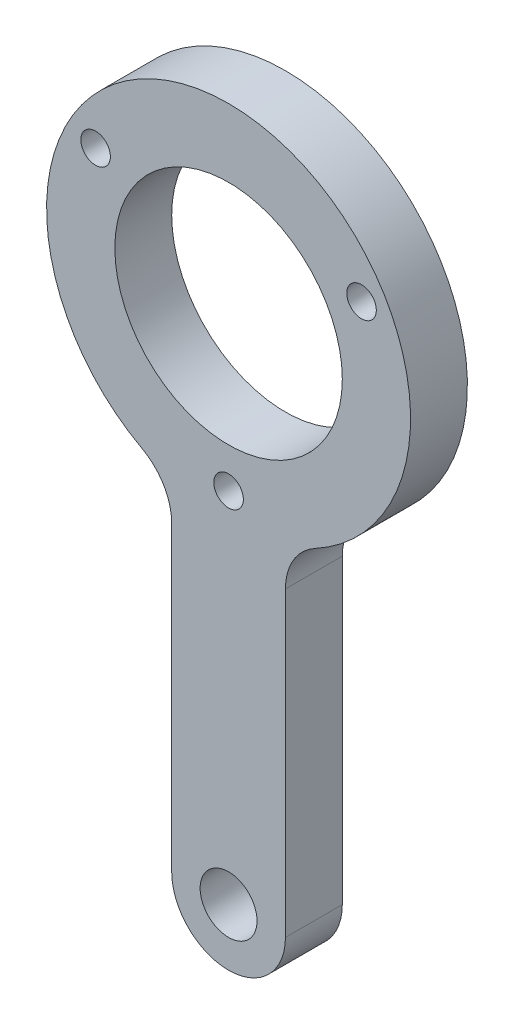
ISO-10303-21;
HEADER;
FILE_DESCRIPTION(('STEP AP214'),'2;1');
FILE_NAME('part.step','',(''),(''),'','','');
FILE_SCHEMA(('AUTOMOTIVE_DESIGN { 1 0 10303 214 1 1 1 1 }'));
ENDSEC;
DATA;
#1=APPLICATION_CONTEXT('core data for automotive mechanical design processes');
#2=APPLICATION_PROTOCOL_DEFINITION('international standard','automotive_design',2000,#1);
#3=PRODUCT_CONTEXT('',#1,'mechanical');
#4=PRODUCT('Part','Part','',(#3));
#5=PRODUCT_RELATED_PRODUCT_CATEGORY('part','',(#4));
#6=PRODUCT_DEFINITION_FORMATION('','',#4);
#7=PRODUCT_DEFINITION_CONTEXT('part definition',#1,'design');
#8=PRODUCT_DEFINITION('design','',#6,#7);
#9=PRODUCT_DEFINITION_SHAPE('','',#8);
#10=(LENGTH_UNIT() NAMED_UNIT(*) SI_UNIT(.MILLI.,.METRE.));
#11=(NAMED_UNIT(*) PLANE_ANGLE_UNIT() SI_UNIT($,.RADIAN.));
#12=(NAMED_UNIT(*) SI_UNIT($,.STERADIAN.) SOLID_ANGLE_UNIT());
#13=UNCERTAINTY_MEASURE_WITH_UNIT(LENGTH_MEASURE(1.E-05),#10,'distance_accuracy_value','');
#14=(GEOMETRIC_REPRESENTATION_CONTEXT(3) GLOBAL_UNCERTAINTY_ASSIGNED_CONTEXT((#13)) GLOBAL_UNIT_ASSIGNED_CONTEXT((#10,
#11,#12)) REPRESENTATION_CONTEXT('',''));
#15=CARTESIAN_POINT('',(0.,0.,0.));
#16=DIRECTION('',(0.,0.,1.));
#17=DIRECTION('',(1.,0.,0.));
#18=AXIS2_PLACEMENT_3D('',#15,#16,#17);
#19=CARTESIAN_POINT('',(0.,-45.,5.));
#20=DIRECTION('',(0.,0.,-1.));
#21=DIRECTION('',(-1.,0.,0.));
#22=AXIS2_PLACEMENT_3D('',#19,#20,#21);
#23=CYLINDRICAL_SURFACE('',#22,5.);
#24=CARTESIAN_POINT('',(0.,-45.,0.));
#25=DIRECTION('',(0.,0.,1.));
#26=DIRECTION('',(1.,0.,0.));
#27=AXIS2_PLACEMENT_3D('',#24,#25,#26);
#28=CIRCLE('',#27,5.);
#29=CARTESIAN_POINT('',(-4.99999999999999,-45.,0.));
#30=VERTEX_POINT('',#29);
#31=CARTESIAN_POINT('',(5.00000000000001,-45.,0.));
#32=VERTEX_POINT('',#31);
#33=EDGE_CURVE('E117',#30,#32,#28,.T.);
#34=ORIENTED_EDGE('',*,*,#33,.T.);
#35=DIRECTION('',(0.,0.,-1.));
#36=VECTOR('',#35,1.);
#37=CARTESIAN_POINT('',(5.00000000000001,-45.,5.));
#38=LINE('',#37,#36);
#39=CARTESIAN_POINT('',(5.00000000000001,-45.,5.));
#40=VERTEX_POINT('',#39);
#41=EDGE_CURVE('E98',#40,#32,#38,.T.);
#42=ORIENTED_EDGE('',*,*,#41,.F.);
#43=CARTESIAN_POINT('',(0.,-45.,5.));
#44=DIRECTION('',(0.,0.,1.));
#45=DIRECTION('',(1.,0.,0.));
#46=AXIS2_PLACEMENT_3D('',#43,#44,#45);
#47=CIRCLE('',#46,5.);
#48=CARTESIAN_POINT('',(-4.99999999999999,-45.,5.));
#49=VERTEX_POINT('',#48);
#50=EDGE_CURVE('E104',#49,#40,#47,.T.);
#51=ORIENTED_EDGE('',*,*,#50,.F.);
#52=DIRECTION('',(0.,0.,-1.));
#53=VECTOR('',#52,1.);
#54=CARTESIAN_POINT('',(-4.99999999999999,-45.,5.));
#55=LINE('',#54,#53);
#56=EDGE_CURVE('E120',#49,#30,#55,.T.);
#57=ORIENTED_EDGE('',*,*,#56,.T.);
#58=EDGE_LOOP('',(#34,#42,#51,#57));
#59=FACE_BOUND('',#58,.T.);
#60=ADVANCED_FACE('F41',(#59),#23,.T.);
#61=CARTESIAN_POINT('',(5.,-8.07774721070176,5.));
#62=DIRECTION('',(-1.,0.,0.));
#63=DIRECTION('',(0.,-1.,0.));
#64=AXIS2_PLACEMENT_3D('',#61,#62,#63);
#65=PLANE('',#64);
#66=DIRECTION('',(0.,1.,0.));
#67=VECTOR('',#66,1.);
#68=CARTESIAN_POINT('',(5.,-8.07774721070176,0.));
#69=LINE('',#68,#67);
#70=CARTESIAN_POINT('',(5.,-18.4661853126194,0.));
#71=VERTEX_POINT('',#70);
#72=EDGE_CURVE('E265',#32,#71,#69,.T.);
#73=ORIENTED_EDGE('',*,*,#72,.T.);
#74=DIRECTION('',(0.,0.,1.));
#75=VECTOR('',#74,1.);
#76=CARTESIAN_POINT('',(5.,-18.4661853126194,5.));
#77=LINE('',#76,#75);
#78=CARTESIAN_POINT('',(5.,-18.4661853126194,5.));
#79=VERTEX_POINT('',#78);
#80=EDGE_CURVE('E100',#71,#79,#77,.T.);
#81=ORIENTED_EDGE('',*,*,#80,.T.);
#82=DIRECTION('',(0.,1.,0.));
#83=VECTOR('',#82,1.);
#84=CARTESIAN_POINT('',(5.,-8.07774721070176,5.));
#85=LINE('',#84,#83);
#86=EDGE_CURVE('E94',#40,#79,#85,.T.);
#87=ORIENTED_EDGE('',*,*,#86,.F.);
#88=ORIENTED_EDGE('',*,*,#41,.T.);
#89=EDGE_LOOP('',(#73,#81,#87,#88));
#90=FACE_BOUND('',#89,.T.);
#91=ADVANCED_FACE('F96',(#90),#65,.F.);
#92=CARTESIAN_POINT('',(-5.,-8.07774721070176,5.));
#93=DIRECTION('',(1.,0.,0.));
#94=DIRECTION('',(0.,1.,0.));
#95=AXIS2_PLACEMENT_3D('',#92,#93,#94);
#96=PLANE('',#95);
#97=DIRECTION('',(0.,-1.,0.));
#98=VECTOR('',#97,1.);
#99=CARTESIAN_POINT('',(-5.,-8.07774721070176,5.));
#100=LINE('',#99,#98);
#101=CARTESIAN_POINT('',(-5.,-18.4661853126194,5.));
#102=VERTEX_POINT('',#101);
#103=EDGE_CURVE('E103',#102,#49,#100,.T.);
#104=ORIENTED_EDGE('',*,*,#103,.F.);
#105=DIRECTION('',(0.,0.,1.));
#106=VECTOR('',#105,1.);
#107=CARTESIAN_POINT('',(-5.,-18.4661853126194,5.));
#108=LINE('',#107,#106);
#109=CARTESIAN_POINT('',(-5.,-18.4661853126194,0.));
#110=VERTEX_POINT('',#109);
#111=EDGE_CURVE('E119',#102,#110,#108,.F.);
#112=ORIENTED_EDGE('',*,*,#111,.T.);
#113=DIRECTION('',(0.,-1.,0.));
#114=VECTOR('',#113,1.);
#115=CARTESIAN_POINT('',(-5.,-8.07774721070176,0.));
#116=LINE('',#115,#114);
#117=EDGE_CURVE('E114',#110,#30,#116,.T.);
#118=ORIENTED_EDGE('',*,*,#117,.T.);
#119=ORIENTED_EDGE('',*,*,#56,.F.);
#120=EDGE_LOOP('',(#104,#112,#118,#119));
#121=FACE_BOUND('',#120,.T.);
#122=ADVANCED_FACE('F178',(#121),#96,.F.);
#123=CARTESIAN_POINT('',(0.,-45.,5.));
#124=DIRECTION('',(0.,0.,1.));
#125=DIRECTION('',(1.,0.,0.));
#126=AXIS2_PLACEMENT_3D('',#123,#124,#125);
#127=PLANE('',#126);
#128=ORIENTED_EDGE('',*,*,#86,.T.);
#129=CARTESIAN_POINT('',(10.,-18.4661853126194,5.));
#130=DIRECTION('',(0.,0.,1.));
#131=DIRECTION('',(1.,0.,0.));
#132=AXIS2_PLACEMENT_3D('',#129,#130,#131);
#133=CIRCLE('',#132,5.);
#134=CARTESIAN_POINT('',(7.61904761904762,-14.0694745239005,5.));
#135=VERTEX_POINT('',#134);
#136=EDGE_CURVE('E50',#79,#135,#133,.F.);
#137=ORIENTED_EDGE('',*,*,#136,.T.);
#138=CARTESIAN_POINT('',(0.,0.,5.));
#139=DIRECTION('',(0.,0.,1.));
#140=DIRECTION('',(1.,0.,0.));
#141=AXIS2_PLACEMENT_3D('',#138,#139,#140);
#142=CIRCLE('',#141,16.);
#143=CARTESIAN_POINT('',(-7.61904761904762,-14.0694745239005,5.));
#144=VERTEX_POINT('',#143);
#145=EDGE_CURVE('E155',#135,#144,#142,.T.);
#146=ORIENTED_EDGE('',*,*,#145,.T.);
#147=CARTESIAN_POINT('',(-10.,-18.4661853126194,5.));
#148=DIRECTION('',(0.,0.,1.));
#149=DIRECTION('',(1.,0.,0.));
#150=AXIS2_PLACEMENT_3D('',#147,#148,#149);
#151=CIRCLE('',#150,5.);
#152=EDGE_CURVE('E150',#144,#102,#151,.F.);
#153=ORIENTED_EDGE('',*,*,#152,.T.);
#154=ORIENTED_EDGE('',*,*,#103,.T.);
#155=ORIENTED_EDGE('',*,*,#50,.T.);
#156=EDGE_LOOP('',(#128,#137,#146,#153,#154,#155));
#157=FACE_BOUND('',#156,.T.);
#158=CARTESIAN_POINT('',(0.,-45.,5.));
#159=DIRECTION('',(0.,0.,1.));
#160=DIRECTION('',(1.,0.,0.));
#161=AXIS2_PLACEMENT_3D('',#158,#159,#160);
#162=CIRCLE('',#161,2.5);
#163=CARTESIAN_POINT('',(2.50000000000001,-45.,5.));
#164=VERTEX_POINT('',#163);
#165=EDGE_CURVE('E134',#164,#164,#162,.T.);
#166=ORIENTED_EDGE('',*,*,#165,.F.);
#167=EDGE_LOOP('',(#166));
#168=FACE_BOUND('',#167,.T.);
#169=CARTESIAN_POINT('',(0.,0.,5.));
#170=DIRECTION('',(0.,0.,1.));
#171=DIRECTION('',(1.,0.,0.));
#172=AXIS2_PLACEMENT_3D('',#169,#170,#171);
#173=CIRCLE('',#172,10.);
#174=CARTESIAN_POINT('',(10.,0.,5.));
#175=VERTEX_POINT('',#174);
#176=EDGE_CURVE('E241',#175,#175,#173,.T.);
#177=ORIENTED_EDGE('',*,*,#176,.F.);
#178=EDGE_LOOP('',(#177));
#179=FACE_BOUND('',#178,.T.);
#180=CARTESIAN_POINT('',(0.,-13.5,5.));
#181=DIRECTION('',(0.,0.,1.));
#182=DIRECTION('',(1.,0.,0.));
#183=AXIS2_PLACEMENT_3D('',#180,#181,#182);
#184=CIRCLE('',#183,1.3);
#185=CARTESIAN_POINT('',(1.3,-13.5,5.));
#186=VERTEX_POINT('',#185);
#187=EDGE_CURVE('E237',#186,#186,#184,.T.);
#188=ORIENTED_EDGE('',*,*,#187,.F.);
#189=EDGE_LOOP('',(#188));
#190=FACE_BOUND('',#189,.T.);
#191=CARTESIAN_POINT('',(11.6913429510899,6.75000000000001,5.));
#192=DIRECTION('',(0.,0.,1.));
#193=DIRECTION('',(1.,0.,0.));
#194=AXIS2_PLACEMENT_3D('',#191,#192,#193);
#195=CIRCLE('',#194,1.3);
#196=CARTESIAN_POINT('',(12.9913429510899,6.75000000000001,5.));
#197=VERTEX_POINT('',#196);
#198=EDGE_CURVE('E221',#197,#197,#195,.T.);
#199=ORIENTED_EDGE('',*,*,#198,.F.);
#200=EDGE_LOOP('',(#199));
#201=FACE_BOUND('',#200,.T.);
#202=CARTESIAN_POINT('',(-11.6913429510899,6.75,5.));
#203=DIRECTION('',(0.,0.,1.));
#204=DIRECTION('',(1.,0.,0.));
#205=AXIS2_PLACEMENT_3D('',#202,#203,#204);
#206=CIRCLE('',#205,1.3);
#207=CARTESIAN_POINT('',(-10.3913429510899,6.75,5.));
#208=VERTEX_POINT('',#207);
#209=EDGE_CURVE('E217',#208,#208,#206,.T.);
#210=ORIENTED_EDGE('',*,*,#209,.F.);
#211=EDGE_LOOP('',(#210));
#212=FACE_BOUND('',#211,.T.);
#213=ADVANCED_FACE('F107',(#157,#168,#179,#190,#201,#212),#127,.T.);
#214=CARTESIAN_POINT('',(0.,-45.,0.));
#215=DIRECTION('',(0.,0.,1.));
#216=DIRECTION('',(1.,0.,0.));
#217=AXIS2_PLACEMENT_3D('',#214,#215,#216);
#218=PLANE('',#217);
#219=ORIENTED_EDGE('',*,*,#117,.F.);
#220=CARTESIAN_POINT('',(-10.,-18.4661853126194,0.));
#221=DIRECTION('',(0.,0.,1.));
#222=DIRECTION('',(1.,0.,0.));
#223=AXIS2_PLACEMENT_3D('',#220,#221,#222);
#224=CIRCLE('',#223,5.);
#225=CARTESIAN_POINT('',(-7.61904761904762,-14.0694745239005,0.));
#226=VERTEX_POINT('',#225);
#227=EDGE_CURVE('E147',#110,#226,#224,.T.);
#228=ORIENTED_EDGE('',*,*,#227,.T.);
#229=CARTESIAN_POINT('',(0.,0.,0.));
#230=DIRECTION('',(0.,0.,1.));
#231=DIRECTION('',(1.,0.,0.));
#232=AXIS2_PLACEMENT_3D('',#229,#230,#231);
#233=CIRCLE('',#232,16.);
#234=CARTESIAN_POINT('',(7.61904761904762,-14.0694745239005,0.));
#235=VERTEX_POINT('',#234);
#236=EDGE_CURVE('E162',#235,#226,#233,.T.);
#237=ORIENTED_EDGE('',*,*,#236,.F.);
#238=CARTESIAN_POINT('',(10.,-18.4661853126194,0.));
#239=DIRECTION('',(0.,0.,1.));
#240=DIRECTION('',(1.,0.,0.));
#241=AXIS2_PLACEMENT_3D('',#238,#239,#240);
#242=CIRCLE('',#241,5.);
#243=EDGE_CURVE('E12',#235,#71,#242,.T.);
#244=ORIENTED_EDGE('',*,*,#243,.T.);
#245=ORIENTED_EDGE('',*,*,#72,.F.);
#246=ORIENTED_EDGE('',*,*,#33,.F.);
#247=EDGE_LOOP('',(#219,#228,#237,#244,#245,#246));
#248=FACE_BOUND('',#247,.T.);
#249=CARTESIAN_POINT('',(0.,-45.,0.));
#250=DIRECTION('',(0.,0.,1.));
#251=DIRECTION('',(1.,0.,0.));
#252=AXIS2_PLACEMENT_3D('',#249,#250,#251);
#253=CIRCLE('',#252,2.5);
#254=CARTESIAN_POINT('',(2.50000000000001,-45.,0.));
#255=VERTEX_POINT('',#254);
#256=EDGE_CURVE('E130',#255,#255,#253,.T.);
#257=ORIENTED_EDGE('',*,*,#256,.T.);
#258=EDGE_LOOP('',(#257));
#259=FACE_BOUND('',#258,.T.);
#260=CARTESIAN_POINT('',(0.,-13.5,0.));
#261=DIRECTION('',(0.,0.,1.));
#262=DIRECTION('',(1.,0.,0.));
#263=AXIS2_PLACEMENT_3D('',#260,#261,#262);
#264=CIRCLE('',#263,1.3);
#265=CARTESIAN_POINT('',(1.3,-13.5,0.));
#266=VERTEX_POINT('',#265);
#267=EDGE_CURVE('E135',#266,#266,#264,.T.);
#268=ORIENTED_EDGE('',*,*,#267,.T.);
#269=EDGE_LOOP('',(#268));
#270=FACE_BOUND('',#269,.T.);
#271=CARTESIAN_POINT('',(0.,0.,0.));
#272=DIRECTION('',(0.,0.,1.));
#273=DIRECTION('',(1.,0.,0.));
#274=AXIS2_PLACEMENT_3D('',#271,#272,#273);
#275=CIRCLE('',#274,10.);
#276=CARTESIAN_POINT('',(10.,0.,0.));
#277=VERTEX_POINT('',#276);
#278=EDGE_CURVE('E138',#277,#277,#275,.T.);
#279=ORIENTED_EDGE('',*,*,#278,.T.);
#280=EDGE_LOOP('',(#279));
#281=FACE_BOUND('',#280,.T.);
#282=CARTESIAN_POINT('',(11.6913429510899,6.75000000000001,0.));
#283=DIRECTION('',(0.,0.,1.));
#284=DIRECTION('',(1.,0.,0.));
#285=AXIS2_PLACEMENT_3D('',#282,#283,#284);
#286=CIRCLE('',#285,1.3);
#287=CARTESIAN_POINT('',(12.9913429510899,6.75000000000001,0.));
#288=VERTEX_POINT('',#287);
#289=EDGE_CURVE('E163',#288,#288,#286,.T.);
#290=ORIENTED_EDGE('',*,*,#289,.T.);
#291=EDGE_LOOP('',(#290));
#292=FACE_BOUND('',#291,.T.);
#293=CARTESIAN_POINT('',(-11.6913429510899,6.75,0.));
#294=DIRECTION('',(0.,0.,1.));
#295=DIRECTION('',(1.,0.,0.));
#296=AXIS2_PLACEMENT_3D('',#293,#294,#295);
#297=CIRCLE('',#296,1.3);
#298=CARTESIAN_POINT('',(-10.3913429510899,6.75,0.));
#299=VERTEX_POINT('',#298);
#300=EDGE_CURVE('E214',#299,#299,#297,.T.);
#301=ORIENTED_EDGE('',*,*,#300,.T.);
#302=EDGE_LOOP('',(#301));
#303=FACE_BOUND('',#302,.T.);
#304=ADVANCED_FACE('F184',(#248,#259,#270,#281,#292,#303),#218,.F.);
#305=CARTESIAN_POINT('',(0.,-45.,-19.));
#306=DIRECTION('',(0.,0.,1.));
#307=DIRECTION('',(1.,0.,0.));
#308=AXIS2_PLACEMENT_3D('',#305,#306,#307);
#309=CYLINDRICAL_SURFACE('',#308,2.5);
#310=ORIENTED_EDGE('',*,*,#165,.T.);
#311=EDGE_LOOP('',(#310));
#312=FACE_BOUND('',#311,.T.);
#313=ORIENTED_EDGE('',*,*,#256,.F.);
#314=EDGE_LOOP('',(#313));
#315=FACE_BOUND('',#314,.T.);
#316=ADVANCED_FACE('F187',(#312,#315),#309,.F.);
#317=CARTESIAN_POINT('',(0.,0.,-5.));
#318=DIRECTION('',(0.,0.,1.));
#319=DIRECTION('',(1.,0.,0.));
#320=AXIS2_PLACEMENT_3D('',#317,#318,#319);
#321=CYLINDRICAL_SURFACE('',#320,10.);
#322=ORIENTED_EDGE('',*,*,#176,.T.);
#323=EDGE_LOOP('',(#322));
#324=FACE_BOUND('',#323,.T.);
#325=ORIENTED_EDGE('',*,*,#278,.F.);
#326=EDGE_LOOP('',(#325));
#327=FACE_BOUND('',#326,.T.);
#328=ADVANCED_FACE('F192',(#324,#327),#321,.F.);
#329=CARTESIAN_POINT('',(0.,-13.5,-5.));
#330=DIRECTION('',(0.,0.,1.));
#331=DIRECTION('',(1.,0.,0.));
#332=AXIS2_PLACEMENT_3D('',#329,#330,#331);
#333=CYLINDRICAL_SURFACE('',#332,1.3);
#334=ORIENTED_EDGE('',*,*,#187,.T.);
#335=EDGE_LOOP('',(#334));
#336=FACE_BOUND('',#335,.T.);
#337=ORIENTED_EDGE('',*,*,#267,.F.);
#338=EDGE_LOOP('',(#337));
#339=FACE_BOUND('',#338,.T.);
#340=ADVANCED_FACE('F196',(#336,#339),#333,.F.);
#341=CARTESIAN_POINT('',(0.,0.,0.));
#342=DIRECTION('',(0.,0.,1.));
#343=DIRECTION('',(1.,0.,0.));
#344=AXIS2_PLACEMENT_3D('',#341,#342,#343);
#345=CYLINDRICAL_SURFACE('',#344,16.);
#346=ORIENTED_EDGE('',*,*,#236,.T.);
#347=DIRECTION('',(0.,0.,1.));
#348=VECTOR('',#347,1.);
#349=CARTESIAN_POINT('',(-7.61904761904762,-14.0694745239005,0.));
#350=LINE('',#349,#348);
#351=EDGE_CURVE('E142',#226,#144,#350,.T.);
#352=ORIENTED_EDGE('',*,*,#351,.T.);
#353=ORIENTED_EDGE('',*,*,#145,.F.);
#354=DIRECTION('',(0.,0.,1.));
#355=VECTOR('',#354,1.);
#356=CARTESIAN_POINT('',(7.61904761904762,-14.0694745239005,0.));
#357=LINE('',#356,#355);
#358=EDGE_CURVE('E125',#135,#235,#357,.F.);
#359=ORIENTED_EDGE('',*,*,#358,.T.);
#360=EDGE_LOOP('',(#346,#352,#353,#359));
#361=FACE_BOUND('',#360,.T.);
#362=ADVANCED_FACE('F159',(#361),#345,.T.);
#363=CARTESIAN_POINT('',(11.6913429510899,6.75000000000001,0.));
#364=DIRECTION('',(0.,0.,1.));
#365=DIRECTION('',(1.,0.,0.));
#366=AXIS2_PLACEMENT_3D('',#363,#364,#365);
#367=CYLINDRICAL_SURFACE('',#366,1.3);
#368=ORIENTED_EDGE('',*,*,#289,.F.);
#369=EDGE_LOOP('',(#368));
#370=FACE_BOUND('',#369,.T.);
#371=ORIENTED_EDGE('',*,*,#198,.T.);
#372=EDGE_LOOP('',(#371));
#373=FACE_BOUND('',#372,.T.);
#374=ADVANCED_FACE('F203',(#370,#373),#367,.F.);
#375=CARTESIAN_POINT('',(-11.6913429510899,6.75,0.));
#376=DIRECTION('',(0.,0.,1.));
#377=DIRECTION('',(1.,0.,0.));
#378=AXIS2_PLACEMENT_3D('',#375,#376,#377);
#379=CYLINDRICAL_SURFACE('',#378,1.3);
#380=ORIENTED_EDGE('',*,*,#300,.F.);
#381=EDGE_LOOP('',(#380));
#382=FACE_BOUND('',#381,.T.);
#383=ORIENTED_EDGE('',*,*,#209,.T.);
#384=EDGE_LOOP('',(#383));
#385=FACE_BOUND('',#384,.T.);
#386=ADVANCED_FACE('F170',(#382,#385),#379,.F.);
#387=CARTESIAN_POINT('',(-10.,-18.4661853126194,0.));
#388=DIRECTION('',(0.,0.,1.));
#389=DIRECTION('',(1.,0.,0.));
#390=AXIS2_PLACEMENT_3D('',#387,#388,#389);
#391=CYLINDRICAL_SURFACE('',#390,5.);
#392=ORIENTED_EDGE('',*,*,#152,.F.);
#393=ORIENTED_EDGE('',*,*,#351,.F.);
#394=ORIENTED_EDGE('',*,*,#227,.F.);
#395=ORIENTED_EDGE('',*,*,#111,.F.);
#396=EDGE_LOOP('',(#392,#393,#394,#395));
#397=FACE_BOUND('',#396,.T.);
#398=ADVANCED_FACE('F166',(#397),#391,.F.);
#399=CARTESIAN_POINT('',(10.,-18.4661853126194,0.));
#400=DIRECTION('',(0.,0.,1.));
#401=DIRECTION('',(1.,0.,0.));
#402=AXIS2_PLACEMENT_3D('',#399,#400,#401);
#403=CYLINDRICAL_SURFACE('',#402,5.);
#404=ORIENTED_EDGE('',*,*,#243,.F.);
#405=ORIENTED_EDGE('',*,*,#358,.F.);
#406=ORIENTED_EDGE('',*,*,#136,.F.);
#407=ORIENTED_EDGE('',*,*,#80,.F.);
#408=EDGE_LOOP('',(#404,#405,#406,#407));
#409=FACE_BOUND('',#408,.T.);
#410=ADVANCED_FACE('F43',(#409),#403,.F.);
#411=CLOSED_SHELL('',(#60,#91,#122,#213,#304,#316,#328,#340,#362,#374,#386,#398,#410));
#412=MANIFOLD_SOLID_BREP('B2',#411);
#413=ADVANCED_BREP_SHAPE_REPRESENTATION('',(#18,#412),#14);
#414=SHAPE_DEFINITION_REPRESENTATION(#9,#413);
ENDSEC;
END-ISO-10303-21;
